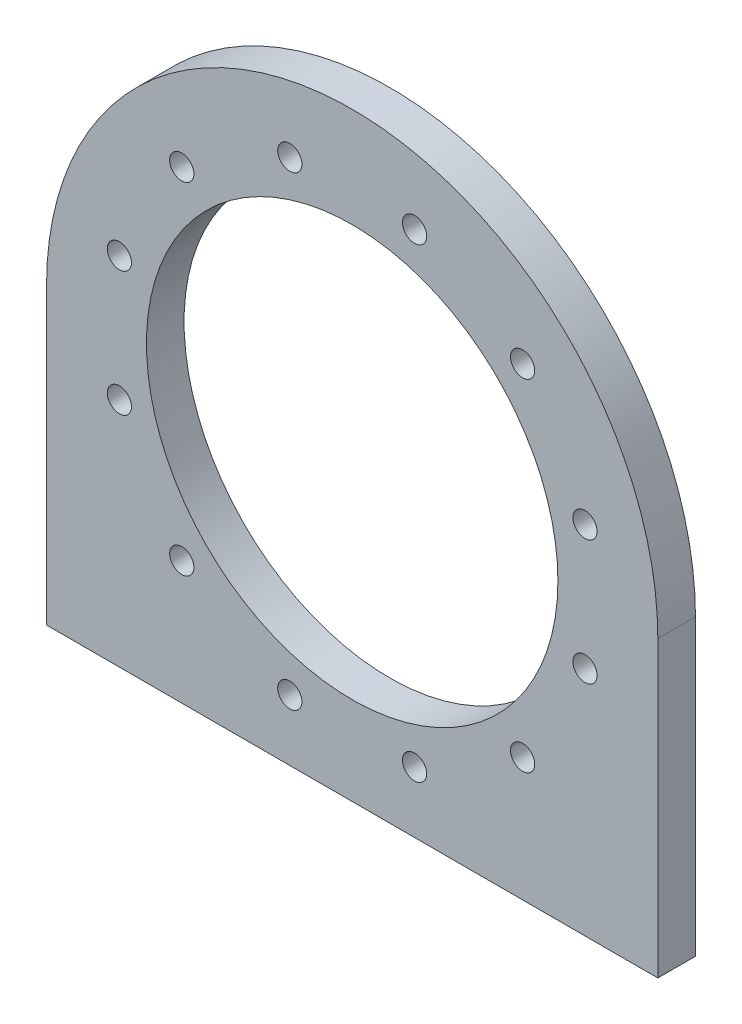
ISO-10303-21;
HEADER;
FILE_DESCRIPTION(('STEP AP214'),'2;1');
FILE_NAME('part.step','',(''),(''),'','','');
FILE_SCHEMA(('AUTOMOTIVE_DESIGN { 1 0 10303 214 1 1 1 1 }'));
ENDSEC;
DATA;
#1=APPLICATION_CONTEXT('core data for automotive mechanical design processes');
#2=APPLICATION_PROTOCOL_DEFINITION('international standard','automotive_design',2000,#1);
#3=PRODUCT_CONTEXT('',#1,'mechanical');
#4=PRODUCT('Part','Part','',(#3));
#5=PRODUCT_RELATED_PRODUCT_CATEGORY('part','',(#4));
#6=PRODUCT_DEFINITION_FORMATION('','',#4);
#7=PRODUCT_DEFINITION_CONTEXT('part definition',#1,'design');
#8=PRODUCT_DEFINITION('design','',#6,#7);
#9=PRODUCT_DEFINITION_SHAPE('','',#8);
#10=(LENGTH_UNIT() NAMED_UNIT(*) SI_UNIT(.MILLI.,.METRE.));
#11=(NAMED_UNIT(*) PLANE_ANGLE_UNIT() SI_UNIT($,.RADIAN.));
#12=(NAMED_UNIT(*) SI_UNIT($,.STERADIAN.) SOLID_ANGLE_UNIT());
#13=UNCERTAINTY_MEASURE_WITH_UNIT(LENGTH_MEASURE(1.E-05),#10,'distance_accuracy_value','');
#14=(GEOMETRIC_REPRESENTATION_CONTEXT(3) GLOBAL_UNCERTAINTY_ASSIGNED_CONTEXT((#13)) GLOBAL_UNIT_ASSIGNED_CONTEXT((#10,
#11,#12)) REPRESENTATION_CONTEXT('',''));
#15=CARTESIAN_POINT('',(0.,0.,0.));
#16=DIRECTION('',(0.,0.,1.));
#17=DIRECTION('',(1.,0.,0.));
#18=AXIS2_PLACEMENT_3D('',#15,#16,#17);
#19=CARTESIAN_POINT('',(0.,0.,16.));
#20=DIRECTION('',(0.,0.,1.));
#21=DIRECTION('',(1.,0.,0.));
#22=AXIS2_PLACEMENT_3D('',#19,#20,#21);
#23=PLANE('',#22);
#24=CARTESIAN_POINT('',(-72.4784450716212,72.478445071621,16.));
#25=DIRECTION('',(0.,0.,1.));
#26=DIRECTION('',(1.,0.,0.));
#27=AXIS2_PLACEMENT_3D('',#24,#25,#26);
#28=CIRCLE('',#27,5.15);
#29=CARTESIAN_POINT('',(-67.3284450716212,72.478445071621,16.));
#30=VERTEX_POINT('',#29);
#31=EDGE_CURVE('E160',#30,#30,#28,.T.);
#32=ORIENTED_EDGE('',*,*,#31,.F.);
#33=EDGE_LOOP('',(#32));
#34=FACE_BOUND('',#33,.T.);
#35=CARTESIAN_POINT('',(-99.0073971946295,26.5289521230082,16.));
#36=DIRECTION('',(0.,0.,1.));
#37=DIRECTION('',(1.,0.,0.));
#38=AXIS2_PLACEMENT_3D('',#35,#36,#37);
#39=CIRCLE('',#38,5.15);
#40=CARTESIAN_POINT('',(-93.8573971946295,26.5289521230082,16.));
#41=VERTEX_POINT('',#40);
#42=EDGE_CURVE('E159',#41,#41,#39,.T.);
#43=ORIENTED_EDGE('',*,*,#42,.F.);
#44=EDGE_LOOP('',(#43));
#45=FACE_BOUND('',#44,.T.);
#46=CARTESIAN_POINT('',(-99.0073971946295,-26.5289521230085,16.));
#47=DIRECTION('',(0.,0.,1.));
#48=DIRECTION('',(1.,0.,0.));
#49=AXIS2_PLACEMENT_3D('',#46,#47,#48);
#50=CIRCLE('',#49,5.15);
#51=CARTESIAN_POINT('',(-93.8573971946295,-26.5289521230085,16.));
#52=VERTEX_POINT('',#51);
#53=EDGE_CURVE('E166',#52,#52,#50,.T.);
#54=ORIENTED_EDGE('',*,*,#53,.F.);
#55=EDGE_LOOP('',(#54));
#56=FACE_BOUND('',#55,.T.);
#57=CARTESIAN_POINT('',(-72.478445071621,-72.4784450716212,16.));
#58=DIRECTION('',(0.,0.,1.));
#59=DIRECTION('',(1.,0.,0.));
#60=AXIS2_PLACEMENT_3D('',#57,#58,#59);
#61=CIRCLE('',#60,5.15);
#62=CARTESIAN_POINT('',(-67.328445071621,-72.4784450716212,16.));
#63=VERTEX_POINT('',#62);
#64=EDGE_CURVE('E172',#63,#63,#61,.T.);
#65=ORIENTED_EDGE('',*,*,#64,.F.);
#66=EDGE_LOOP('',(#65));
#67=FACE_BOUND('',#66,.T.);
#68=CARTESIAN_POINT('',(-26.5289521230083,-99.0073971946295,16.));
#69=DIRECTION('',(0.,0.,1.));
#70=DIRECTION('',(1.,0.,0.));
#71=AXIS2_PLACEMENT_3D('',#68,#69,#70);
#72=CIRCLE('',#71,5.15);
#73=CARTESIAN_POINT('',(-21.3789521230083,-99.0073971946295,16.));
#74=VERTEX_POINT('',#73);
#75=EDGE_CURVE('E178',#74,#74,#72,.T.);
#76=ORIENTED_EDGE('',*,*,#75,.F.);
#77=EDGE_LOOP('',(#76));
#78=FACE_BOUND('',#77,.T.);
#79=CARTESIAN_POINT('',(26.5289521230085,-99.0073971946295,16.));
#80=DIRECTION('',(0.,0.,1.));
#81=DIRECTION('',(1.,0.,0.));
#82=AXIS2_PLACEMENT_3D('',#79,#80,#81);
#83=CIRCLE('',#82,5.15000000000001);
#84=CARTESIAN_POINT('',(31.6789521230085,-99.0073971946295,16.));
#85=VERTEX_POINT('',#84);
#86=EDGE_CURVE('E184',#85,#85,#83,.T.);
#87=ORIENTED_EDGE('',*,*,#86,.F.);
#88=EDGE_LOOP('',(#87));
#89=FACE_BOUND('',#88,.T.);
#90=CARTESIAN_POINT('',(72.4784450716212,-72.478445071621,16.));
#91=DIRECTION('',(0.,0.,1.));
#92=DIRECTION('',(1.,0.,0.));
#93=AXIS2_PLACEMENT_3D('',#90,#91,#92);
#94=CIRCLE('',#93,5.15);
#95=CARTESIAN_POINT('',(77.6284450716212,-72.478445071621,16.));
#96=VERTEX_POINT('',#95);
#97=EDGE_CURVE('E130',#96,#96,#94,.T.);
#98=ORIENTED_EDGE('',*,*,#97,.F.);
#99=EDGE_LOOP('',(#98));
#100=FACE_BOUND('',#99,.T.);
#101=CARTESIAN_POINT('',(99.0073971946295,-26.5289521230083,16.));
#102=DIRECTION('',(0.,0.,1.));
#103=DIRECTION('',(1.,0.,0.));
#104=AXIS2_PLACEMENT_3D('',#101,#102,#103);
#105=CIRCLE('',#104,5.15);
#106=CARTESIAN_POINT('',(104.15739719463,-26.5289521230083,16.));
#107=VERTEX_POINT('',#106);
#108=EDGE_CURVE('E129',#107,#107,#105,.T.);
#109=ORIENTED_EDGE('',*,*,#108,.F.);
#110=EDGE_LOOP('',(#109));
#111=FACE_BOUND('',#110,.T.);
#112=CARTESIAN_POINT('',(99.0073971946295,26.5289521230085,16.));
#113=DIRECTION('',(0.,0.,1.));
#114=DIRECTION('',(1.,0.,0.));
#115=AXIS2_PLACEMENT_3D('',#112,#113,#114);
#116=CIRCLE('',#115,5.15000000000034);
#117=CARTESIAN_POINT('',(104.15739719463,26.5289521230085,16.));
#118=VERTEX_POINT('',#117);
#119=EDGE_CURVE('E137',#118,#118,#116,.T.);
#120=ORIENTED_EDGE('',*,*,#119,.F.);
#121=EDGE_LOOP('',(#120));
#122=FACE_BOUND('',#121,.T.);
#123=CARTESIAN_POINT('',(72.4784450716211,72.4784450716212,16.));
#124=DIRECTION('',(0.,0.,1.));
#125=DIRECTION('',(1.,0.,0.));
#126=AXIS2_PLACEMENT_3D('',#123,#124,#125);
#127=CIRCLE('',#126,5.15000000000024);
#128=CARTESIAN_POINT('',(77.6284450716213,72.4784450716212,16.));
#129=VERTEX_POINT('',#128);
#130=EDGE_CURVE('E143',#129,#129,#127,.T.);
#131=ORIENTED_EDGE('',*,*,#130,.F.);
#132=EDGE_LOOP('',(#131));
#133=FACE_BOUND('',#132,.T.);
#134=CARTESIAN_POINT('',(26.5289521230083,99.0073971946295,16.));
#135=DIRECTION('',(0.,0.,1.));
#136=DIRECTION('',(1.,0.,0.));
#137=AXIS2_PLACEMENT_3D('',#134,#135,#136);
#138=CIRCLE('',#137,5.15000000000008);
#139=CARTESIAN_POINT('',(31.6789521230084,99.0073971946295,16.));
#140=VERTEX_POINT('',#139);
#141=EDGE_CURVE('E149',#140,#140,#138,.T.);
#142=ORIENTED_EDGE('',*,*,#141,.F.);
#143=EDGE_LOOP('',(#142));
#144=FACE_BOUND('',#143,.T.);
#145=CARTESIAN_POINT('',(-26.5289521230085,99.0073971946295,16.));
#146=DIRECTION('',(0.,0.,1.));
#147=DIRECTION('',(1.,0.,0.));
#148=AXIS2_PLACEMENT_3D('',#145,#146,#147);
#149=CIRCLE('',#148,5.15);
#150=CARTESIAN_POINT('',(-21.3789521230085,99.0073971946295,16.));
#151=VERTEX_POINT('',#150);
#152=EDGE_CURVE('E122',#151,#151,#149,.T.);
#153=ORIENTED_EDGE('',*,*,#152,.F.);
#154=EDGE_LOOP('',(#153));
#155=FACE_BOUND('',#154,.T.);
#156=CARTESIAN_POINT('',(0.,0.,16.));
#157=DIRECTION('',(0.,0.,1.));
#158=DIRECTION('',(1.,0.,0.));
#159=AXIS2_PLACEMENT_3D('',#156,#157,#158);
#160=CIRCLE('',#159,130.);
#161=CARTESIAN_POINT('',(130.,0.,16.));
#162=VERTEX_POINT('',#161);
#163=CARTESIAN_POINT('',(-130.,0.,16.));
#164=VERTEX_POINT('',#163);
#165=EDGE_CURVE('E87',#162,#164,#160,.T.);
#166=ORIENTED_EDGE('',*,*,#165,.T.);
#167=DIRECTION('',(0.,-1.,0.));
#168=VECTOR('',#167,1.);
#169=CARTESIAN_POINT('',(-130.,0.,16.));
#170=LINE('',#169,#168);
#171=CARTESIAN_POINT('',(-130.,-125.,16.));
#172=VERTEX_POINT('',#171);
#173=EDGE_CURVE('E82',#164,#172,#170,.T.);
#174=ORIENTED_EDGE('',*,*,#173,.T.);
#175=DIRECTION('',(1.,0.,0.));
#176=VECTOR('',#175,1.);
#177=CARTESIAN_POINT('',(-130.,-125.,16.));
#178=LINE('',#177,#176);
#179=CARTESIAN_POINT('',(130.,-125.,16.));
#180=VERTEX_POINT('',#179);
#181=EDGE_CURVE('E85',#172,#180,#178,.T.);
#182=ORIENTED_EDGE('',*,*,#181,.T.);
#183=DIRECTION('',(0.,1.,0.));
#184=VECTOR('',#183,1.);
#185=CARTESIAN_POINT('',(130.,-125.,16.));
#186=LINE('',#185,#184);
#187=EDGE_CURVE('E52',#180,#162,#186,.T.);
#188=ORIENTED_EDGE('',*,*,#187,.T.);
#189=EDGE_LOOP('',(#166,#174,#182,#188));
#190=FACE_BOUND('',#189,.T.);
#191=CARTESIAN_POINT('',(0.,0.,16.));
#192=DIRECTION('',(0.,0.,1.));
#193=DIRECTION('',(1.,0.,0.));
#194=AXIS2_PLACEMENT_3D('',#191,#192,#193);
#195=CIRCLE('',#194,87.5);
#196=CARTESIAN_POINT('',(87.5,0.,16.));
#197=VERTEX_POINT('',#196);
#198=EDGE_CURVE('E102',#197,#197,#195,.T.);
#199=ORIENTED_EDGE('',*,*,#198,.F.);
#200=EDGE_LOOP('',(#199));
#201=FACE_BOUND('',#200,.T.);
#202=ADVANCED_FACE('F35',(#34,#45,#56,#67,#78,#89,#100,#111,#122,#133,#144,#155,#190,#201),#23,.T.);
#203=CARTESIAN_POINT('',(0.,0.,0.));
#204=DIRECTION('',(0.,0.,1.));
#205=DIRECTION('',(1.,0.,0.));
#206=AXIS2_PLACEMENT_3D('',#203,#204,#205);
#207=PLANE('',#206);
#208=CARTESIAN_POINT('',(-72.4784450716212,72.478445071621,0.));
#209=DIRECTION('',(0.,0.,1.));
#210=DIRECTION('',(1.,0.,0.));
#211=AXIS2_PLACEMENT_3D('',#208,#209,#210);
#212=CIRCLE('',#211,5.15);
#213=CARTESIAN_POINT('',(-67.3284450716212,72.478445071621,0.));
#214=VERTEX_POINT('',#213);
#215=EDGE_CURVE('E156',#214,#214,#212,.F.);
#216=ORIENTED_EDGE('',*,*,#215,.F.);
#217=EDGE_LOOP('',(#216));
#218=FACE_BOUND('',#217,.T.);
#219=CARTESIAN_POINT('',(-99.0073971946295,26.5289521230082,0.));
#220=DIRECTION('',(0.,0.,1.));
#221=DIRECTION('',(1.,0.,0.));
#222=AXIS2_PLACEMENT_3D('',#219,#220,#221);
#223=CIRCLE('',#222,5.15);
#224=CARTESIAN_POINT('',(-93.8573971946295,26.5289521230082,0.));
#225=VERTEX_POINT('',#224);
#226=EDGE_CURVE('E163',#225,#225,#223,.F.);
#227=ORIENTED_EDGE('',*,*,#226,.F.);
#228=EDGE_LOOP('',(#227));
#229=FACE_BOUND('',#228,.T.);
#230=CARTESIAN_POINT('',(-99.0073971946295,-26.5289521230085,0.));
#231=DIRECTION('',(0.,0.,1.));
#232=DIRECTION('',(1.,0.,0.));
#233=AXIS2_PLACEMENT_3D('',#230,#231,#232);
#234=CIRCLE('',#233,5.15);
#235=CARTESIAN_POINT('',(-93.8573971946295,-26.5289521230085,0.));
#236=VERTEX_POINT('',#235);
#237=EDGE_CURVE('E169',#236,#236,#234,.F.);
#238=ORIENTED_EDGE('',*,*,#237,.F.);
#239=EDGE_LOOP('',(#238));
#240=FACE_BOUND('',#239,.T.);
#241=CARTESIAN_POINT('',(-72.478445071621,-72.4784450716212,0.));
#242=DIRECTION('',(0.,0.,1.));
#243=DIRECTION('',(1.,0.,0.));
#244=AXIS2_PLACEMENT_3D('',#241,#242,#243);
#245=CIRCLE('',#244,5.15);
#246=CARTESIAN_POINT('',(-67.328445071621,-72.4784450716212,0.));
#247=VERTEX_POINT('',#246);
#248=EDGE_CURVE('E175',#247,#247,#245,.F.);
#249=ORIENTED_EDGE('',*,*,#248,.F.);
#250=EDGE_LOOP('',(#249));
#251=FACE_BOUND('',#250,.T.);
#252=CARTESIAN_POINT('',(-26.5289521230083,-99.0073971946295,0.));
#253=DIRECTION('',(0.,0.,1.));
#254=DIRECTION('',(1.,0.,0.));
#255=AXIS2_PLACEMENT_3D('',#252,#253,#254);
#256=CIRCLE('',#255,5.15);
#257=CARTESIAN_POINT('',(-21.3789521230083,-99.0073971946295,0.));
#258=VERTEX_POINT('',#257);
#259=EDGE_CURVE('E181',#258,#258,#256,.F.);
#260=ORIENTED_EDGE('',*,*,#259,.F.);
#261=EDGE_LOOP('',(#260));
#262=FACE_BOUND('',#261,.T.);
#263=CARTESIAN_POINT('',(26.5289521230085,-99.0073971946295,0.));
#264=DIRECTION('',(0.,0.,1.));
#265=DIRECTION('',(1.,0.,0.));
#266=AXIS2_PLACEMENT_3D('',#263,#264,#265);
#267=CIRCLE('',#266,5.15000000000001);
#268=CARTESIAN_POINT('',(31.6789521230085,-99.0073971946295,0.));
#269=VERTEX_POINT('',#268);
#270=EDGE_CURVE('E133',#269,#269,#267,.F.);
#271=ORIENTED_EDGE('',*,*,#270,.F.);
#272=EDGE_LOOP('',(#271));
#273=FACE_BOUND('',#272,.T.);
#274=CARTESIAN_POINT('',(72.4784450716212,-72.478445071621,0.));
#275=DIRECTION('',(0.,0.,1.));
#276=DIRECTION('',(1.,0.,0.));
#277=AXIS2_PLACEMENT_3D('',#274,#275,#276);
#278=CIRCLE('',#277,5.15);
#279=CARTESIAN_POINT('',(77.6284450716212,-72.478445071621,0.));
#280=VERTEX_POINT('',#279);
#281=EDGE_CURVE('E126',#280,#280,#278,.F.);
#282=ORIENTED_EDGE('',*,*,#281,.F.);
#283=EDGE_LOOP('',(#282));
#284=FACE_BOUND('',#283,.T.);
#285=CARTESIAN_POINT('',(99.0073971946295,-26.5289521230083,0.));
#286=DIRECTION('',(0.,0.,1.));
#287=DIRECTION('',(1.,0.,0.));
#288=AXIS2_PLACEMENT_3D('',#285,#286,#287);
#289=CIRCLE('',#288,5.15);
#290=CARTESIAN_POINT('',(104.15739719463,-26.5289521230083,0.));
#291=VERTEX_POINT('',#290);
#292=EDGE_CURVE('E134',#291,#291,#289,.F.);
#293=ORIENTED_EDGE('',*,*,#292,.F.);
#294=EDGE_LOOP('',(#293));
#295=FACE_BOUND('',#294,.T.);
#296=CARTESIAN_POINT('',(99.0073971946295,26.5289521230085,0.));
#297=DIRECTION('',(0.,0.,1.));
#298=DIRECTION('',(1.,0.,0.));
#299=AXIS2_PLACEMENT_3D('',#296,#297,#298);
#300=CIRCLE('',#299,5.15000000000034);
#301=CARTESIAN_POINT('',(104.15739719463,26.5289521230085,0.));
#302=VERTEX_POINT('',#301);
#303=EDGE_CURVE('E140',#302,#302,#300,.F.);
#304=ORIENTED_EDGE('',*,*,#303,.F.);
#305=EDGE_LOOP('',(#304));
#306=FACE_BOUND('',#305,.T.);
#307=CARTESIAN_POINT('',(72.4784450716211,72.4784450716212,0.));
#308=DIRECTION('',(0.,0.,1.));
#309=DIRECTION('',(1.,0.,0.));
#310=AXIS2_PLACEMENT_3D('',#307,#308,#309);
#311=CIRCLE('',#310,5.15000000000024);
#312=CARTESIAN_POINT('',(77.6284450716213,72.4784450716212,0.));
#313=VERTEX_POINT('',#312);
#314=EDGE_CURVE('E146',#313,#313,#311,.F.);
#315=ORIENTED_EDGE('',*,*,#314,.F.);
#316=EDGE_LOOP('',(#315));
#317=FACE_BOUND('',#316,.T.);
#318=CARTESIAN_POINT('',(26.5289521230083,99.0073971946295,0.));
#319=DIRECTION('',(0.,0.,1.));
#320=DIRECTION('',(1.,0.,0.));
#321=AXIS2_PLACEMENT_3D('',#318,#319,#320);
#322=CIRCLE('',#321,5.15000000000008);
#323=CARTESIAN_POINT('',(31.6789521230084,99.0073971946295,0.));
#324=VERTEX_POINT('',#323);
#325=EDGE_CURVE('E125',#324,#324,#322,.F.);
#326=ORIENTED_EDGE('',*,*,#325,.F.);
#327=EDGE_LOOP('',(#326));
#328=FACE_BOUND('',#327,.T.);
#329=CARTESIAN_POINT('',(-26.5289521230085,99.0073971946295,0.));
#330=DIRECTION('',(0.,0.,1.));
#331=DIRECTION('',(1.,0.,0.));
#332=AXIS2_PLACEMENT_3D('',#329,#330,#331);
#333=CIRCLE('',#332,5.15);
#334=CARTESIAN_POINT('',(-21.3789521230085,99.0073971946295,0.));
#335=VERTEX_POINT('',#334);
#336=EDGE_CURVE('E117',#335,#335,#333,.F.);
#337=ORIENTED_EDGE('',*,*,#336,.F.);
#338=EDGE_LOOP('',(#337));
#339=FACE_BOUND('',#338,.T.);
#340=CARTESIAN_POINT('',(0.,0.,0.));
#341=DIRECTION('',(0.,0.,1.));
#342=DIRECTION('',(1.,0.,0.));
#343=AXIS2_PLACEMENT_3D('',#340,#341,#342);
#344=CIRCLE('',#343,130.);
#345=CARTESIAN_POINT('',(130.,0.,0.));
#346=VERTEX_POINT('',#345);
#347=CARTESIAN_POINT('',(-130.,0.,0.));
#348=VERTEX_POINT('',#347);
#349=EDGE_CURVE('E99',#346,#348,#344,.T.);
#350=ORIENTED_EDGE('',*,*,#349,.F.);
#351=DIRECTION('',(0.,1.,0.));
#352=VECTOR('',#351,1.);
#353=CARTESIAN_POINT('',(130.,-125.,0.));
#354=LINE('',#353,#352);
#355=CARTESIAN_POINT('',(130.,-125.,0.));
#356=VERTEX_POINT('',#355);
#357=EDGE_CURVE('E75',#356,#346,#354,.T.);
#358=ORIENTED_EDGE('',*,*,#357,.F.);
#359=DIRECTION('',(1.,0.,0.));
#360=VECTOR('',#359,1.);
#361=CARTESIAN_POINT('',(-130.,-125.,0.));
#362=LINE('',#361,#360);
#363=CARTESIAN_POINT('',(-130.,-125.,0.));
#364=VERTEX_POINT('',#363);
#365=EDGE_CURVE('E69',#364,#356,#362,.T.);
#366=ORIENTED_EDGE('',*,*,#365,.F.);
#367=DIRECTION('',(0.,-1.,0.));
#368=VECTOR('',#367,1.);
#369=CARTESIAN_POINT('',(-130.,0.,0.));
#370=LINE('',#369,#368);
#371=EDGE_CURVE('E91',#348,#364,#370,.T.);
#372=ORIENTED_EDGE('',*,*,#371,.F.);
#373=EDGE_LOOP('',(#350,#358,#366,#372));
#374=FACE_BOUND('',#373,.T.);
#375=CARTESIAN_POINT('',(0.,0.,0.));
#376=DIRECTION('',(0.,0.,1.));
#377=DIRECTION('',(1.,0.,0.));
#378=AXIS2_PLACEMENT_3D('',#375,#376,#377);
#379=CIRCLE('',#378,87.5);
#380=CARTESIAN_POINT('',(87.5,0.,0.));
#381=VERTEX_POINT('',#380);
#382=EDGE_CURVE('E114',#381,#381,#379,.T.);
#383=ORIENTED_EDGE('',*,*,#382,.T.);
#384=EDGE_LOOP('',(#383));
#385=FACE_BOUND('',#384,.T.);
#386=ADVANCED_FACE('F110',(#218,#229,#240,#251,#262,#273,#284,#295,#306,#317,#328,#339,#374,
#385),#207,.F.);
#387=CARTESIAN_POINT('',(0.,0.,16.));
#388=DIRECTION('',(0.,0.,-1.));
#389=DIRECTION('',(-1.,0.,0.));
#390=AXIS2_PLACEMENT_3D('',#387,#388,#389);
#391=CYLINDRICAL_SURFACE('',#390,130.);
#392=ORIENTED_EDGE('',*,*,#349,.T.);
#393=DIRECTION('',(0.,0.,-1.));
#394=VECTOR('',#393,1.);
#395=CARTESIAN_POINT('',(-130.,0.,16.));
#396=LINE('',#395,#394);
#397=EDGE_CURVE('E11',#164,#348,#396,.T.);
#398=ORIENTED_EDGE('',*,*,#397,.F.);
#399=ORIENTED_EDGE('',*,*,#165,.F.);
#400=DIRECTION('',(0.,0.,-1.));
#401=VECTOR('',#400,1.);
#402=CARTESIAN_POINT('',(130.,0.,16.));
#403=LINE('',#402,#401);
#404=EDGE_CURVE('E95',#162,#346,#403,.T.);
#405=ORIENTED_EDGE('',*,*,#404,.T.);
#406=EDGE_LOOP('',(#392,#398,#399,#405));
#407=FACE_BOUND('',#406,.T.);
#408=ADVANCED_FACE('F37',(#407),#391,.T.);
#409=CARTESIAN_POINT('',(-130.,0.,16.));
#410=DIRECTION('',(1.,0.,0.));
#411=DIRECTION('',(0.,1.,0.));
#412=AXIS2_PLACEMENT_3D('',#409,#410,#411);
#413=PLANE('',#412);
#414=ORIENTED_EDGE('',*,*,#371,.T.);
#415=DIRECTION('',(0.,0.,-1.));
#416=VECTOR('',#415,1.);
#417=CARTESIAN_POINT('',(-130.,-125.,16.));
#418=LINE('',#417,#416);
#419=EDGE_CURVE('E44',#172,#364,#418,.T.);
#420=ORIENTED_EDGE('',*,*,#419,.F.);
#421=ORIENTED_EDGE('',*,*,#173,.F.);
#422=ORIENTED_EDGE('',*,*,#397,.T.);
#423=EDGE_LOOP('',(#414,#420,#421,#422));
#424=FACE_BOUND('',#423,.T.);
#425=ADVANCED_FACE('F90',(#424),#413,.F.);
#426=CARTESIAN_POINT('',(-130.,-125.,16.));
#427=DIRECTION('',(0.,1.,0.));
#428=DIRECTION('',(0.,0.,1.));
#429=AXIS2_PLACEMENT_3D('',#426,#427,#428);
#430=PLANE('',#429);
#431=ORIENTED_EDGE('',*,*,#365,.T.);
#432=DIRECTION('',(0.,0.,-1.));
#433=VECTOR('',#432,1.);
#434=CARTESIAN_POINT('',(130.,-125.,16.));
#435=LINE('',#434,#433);
#436=EDGE_CURVE('E92',#180,#356,#435,.T.);
#437=ORIENTED_EDGE('',*,*,#436,.F.);
#438=ORIENTED_EDGE('',*,*,#181,.F.);
#439=ORIENTED_EDGE('',*,*,#419,.T.);
#440=EDGE_LOOP('',(#431,#437,#438,#439));
#441=FACE_BOUND('',#440,.T.);
#442=ADVANCED_FACE('F93',(#441),#430,.F.);
#443=CARTESIAN_POINT('',(130.,-125.,16.));
#444=DIRECTION('',(-1.,0.,0.));
#445=DIRECTION('',(0.,-1.,0.));
#446=AXIS2_PLACEMENT_3D('',#443,#444,#445);
#447=PLANE('',#446);
#448=ORIENTED_EDGE('',*,*,#357,.T.);
#449=ORIENTED_EDGE('',*,*,#404,.F.);
#450=ORIENTED_EDGE('',*,*,#187,.F.);
#451=ORIENTED_EDGE('',*,*,#436,.T.);
#452=EDGE_LOOP('',(#448,#449,#450,#451));
#453=FACE_BOUND('',#452,.T.);
#454=ADVANCED_FACE('F107',(#453),#447,.F.);
#455=CARTESIAN_POINT('',(0.,0.,16.));
#456=DIRECTION('',(0.,0.,-1.));
#457=DIRECTION('',(-1.,0.,0.));
#458=AXIS2_PLACEMENT_3D('',#455,#456,#457);
#459=CYLINDRICAL_SURFACE('',#458,87.5);
#460=ORIENTED_EDGE('',*,*,#198,.T.);
#461=EDGE_LOOP('',(#460));
#462=FACE_BOUND('',#461,.T.);
#463=ORIENTED_EDGE('',*,*,#382,.F.);
#464=EDGE_LOOP('',(#463));
#465=FACE_BOUND('',#464,.T.);
#466=ADVANCED_FACE('F215',(#462,#465),#459,.F.);
#467=CARTESIAN_POINT('',(-26.5289521230085,99.0073971946295,-0.001000000000001));
#468=DIRECTION('',(0.,0.,1.));
#469=DIRECTION('',(1.,0.,0.));
#470=AXIS2_PLACEMENT_3D('',#467,#468,#469);
#471=CYLINDRICAL_SURFACE('',#470,5.15);
#472=ORIENTED_EDGE('',*,*,#152,.T.);
#473=EDGE_LOOP('',(#472));
#474=FACE_BOUND('',#473,.T.);
#475=ORIENTED_EDGE('',*,*,#336,.T.);
#476=EDGE_LOOP('',(#475));
#477=FACE_BOUND('',#476,.T.);
#478=ADVANCED_FACE('F211',(#474,#477),#471,.F.);
#479=CARTESIAN_POINT('',(26.5289521230083,99.0073971946295,-0.001000000000001));
#480=DIRECTION('',(0.,0.,1.));
#481=DIRECTION('',(1.,0.,0.));
#482=AXIS2_PLACEMENT_3D('',#479,#480,#481);
#483=CYLINDRICAL_SURFACE('',#482,5.15000000000008);
#484=ORIENTED_EDGE('',*,*,#141,.T.);
#485=EDGE_LOOP('',(#484));
#486=FACE_BOUND('',#485,.T.);
#487=ORIENTED_EDGE('',*,*,#325,.T.);
#488=EDGE_LOOP('',(#487));
#489=FACE_BOUND('',#488,.T.);
#490=ADVANCED_FACE('F214',(#486,#489),#483,.F.);
#491=CARTESIAN_POINT('',(72.4784450716211,72.4784450716212,-0.001000000000001));
#492=DIRECTION('',(0.,0.,1.));
#493=DIRECTION('',(1.,0.,0.));
#494=AXIS2_PLACEMENT_3D('',#491,#492,#493);
#495=CYLINDRICAL_SURFACE('',#494,5.15000000000024);
#496=ORIENTED_EDGE('',*,*,#130,.T.);
#497=EDGE_LOOP('',(#496));
#498=FACE_BOUND('',#497,.T.);
#499=ORIENTED_EDGE('',*,*,#314,.T.);
#500=EDGE_LOOP('',(#499));
#501=FACE_BOUND('',#500,.T.);
#502=ADVANCED_FACE('F262',(#498,#501),#495,.F.);
#503=CARTESIAN_POINT('',(99.0073971946295,26.5289521230085,-0.001000000000001));
#504=DIRECTION('',(0.,0.,1.));
#505=DIRECTION('',(1.,0.,0.));
#506=AXIS2_PLACEMENT_3D('',#503,#504,#505);
#507=CYLINDRICAL_SURFACE('',#506,5.15000000000034);
#508=ORIENTED_EDGE('',*,*,#119,.T.);
#509=EDGE_LOOP('',(#508));
#510=FACE_BOUND('',#509,.T.);
#511=ORIENTED_EDGE('',*,*,#303,.T.);
#512=EDGE_LOOP('',(#511));
#513=FACE_BOUND('',#512,.T.);
#514=ADVANCED_FACE('F270',(#510,#513),#507,.F.);
#515=CARTESIAN_POINT('',(99.0073971946295,-26.5289521230083,-0.001000000000001));
#516=DIRECTION('',(0.,0.,1.));
#517=DIRECTION('',(1.,0.,0.));
#518=AXIS2_PLACEMENT_3D('',#515,#516,#517);
#519=CYLINDRICAL_SURFACE('',#518,5.15);
#520=ORIENTED_EDGE('',*,*,#108,.T.);
#521=EDGE_LOOP('',(#520));
#522=FACE_BOUND('',#521,.T.);
#523=ORIENTED_EDGE('',*,*,#292,.T.);
#524=EDGE_LOOP('',(#523));
#525=FACE_BOUND('',#524,.T.);
#526=ADVANCED_FACE('F278',(#522,#525),#519,.F.);
#527=CARTESIAN_POINT('',(72.4784450716212,-72.478445071621,-0.001000000000001));
#528=DIRECTION('',(0.,0.,1.));
#529=DIRECTION('',(1.,0.,0.));
#530=AXIS2_PLACEMENT_3D('',#527,#528,#529);
#531=CYLINDRICAL_SURFACE('',#530,5.15);
#532=ORIENTED_EDGE('',*,*,#97,.T.);
#533=EDGE_LOOP('',(#532));
#534=FACE_BOUND('',#533,.T.);
#535=ORIENTED_EDGE('',*,*,#281,.T.);
#536=EDGE_LOOP('',(#535));
#537=FACE_BOUND('',#536,.T.);
#538=ADVANCED_FACE('F286',(#534,#537),#531,.F.);
#539=CARTESIAN_POINT('',(26.5289521230085,-99.0073971946295,-0.001000000000001));
#540=DIRECTION('',(0.,0.,1.));
#541=DIRECTION('',(1.,0.,0.));
#542=AXIS2_PLACEMENT_3D('',#539,#540,#541);
#543=CYLINDRICAL_SURFACE('',#542,5.15000000000001);
#544=ORIENTED_EDGE('',*,*,#86,.T.);
#545=EDGE_LOOP('',(#544));
#546=FACE_BOUND('',#545,.T.);
#547=ORIENTED_EDGE('',*,*,#270,.T.);
#548=EDGE_LOOP('',(#547));
#549=FACE_BOUND('',#548,.T.);
#550=ADVANCED_FACE('F192',(#546,#549),#543,.F.);
#551=CARTESIAN_POINT('',(-26.5289521230083,-99.0073971946295,-0.001000000000001));
#552=DIRECTION('',(0.,0.,1.));
#553=DIRECTION('',(1.,0.,0.));
#554=AXIS2_PLACEMENT_3D('',#551,#552,#553);
#555=CYLINDRICAL_SURFACE('',#554,5.15);
#556=ORIENTED_EDGE('',*,*,#75,.T.);
#557=EDGE_LOOP('',(#556));
#558=FACE_BOUND('',#557,.T.);
#559=ORIENTED_EDGE('',*,*,#259,.T.);
#560=EDGE_LOOP('',(#559));
#561=FACE_BOUND('',#560,.T.);
#562=ADVANCED_FACE('F301',(#558,#561),#555,.F.);
#563=CARTESIAN_POINT('',(-72.478445071621,-72.4784450716212,-0.001000000000001));
#564=DIRECTION('',(0.,0.,1.));
#565=DIRECTION('',(1.,0.,0.));
#566=AXIS2_PLACEMENT_3D('',#563,#564,#565);
#567=CYLINDRICAL_SURFACE('',#566,5.15);
#568=ORIENTED_EDGE('',*,*,#64,.T.);
#569=EDGE_LOOP('',(#568));
#570=FACE_BOUND('',#569,.T.);
#571=ORIENTED_EDGE('',*,*,#248,.T.);
#572=EDGE_LOOP('',(#571));
#573=FACE_BOUND('',#572,.T.);
#574=ADVANCED_FACE('F308',(#570,#573),#567,.F.);
#575=CARTESIAN_POINT('',(-99.0073971946295,-26.5289521230085,-0.001000000000001));
#576=DIRECTION('',(0.,0.,1.));
#577=DIRECTION('',(1.,0.,0.));
#578=AXIS2_PLACEMENT_3D('',#575,#576,#577);
#579=CYLINDRICAL_SURFACE('',#578,5.15);
#580=ORIENTED_EDGE('',*,*,#53,.T.);
#581=EDGE_LOOP('',(#580));
#582=FACE_BOUND('',#581,.T.);
#583=ORIENTED_EDGE('',*,*,#237,.T.);
#584=EDGE_LOOP('',(#583));
#585=FACE_BOUND('',#584,.T.);
#586=ADVANCED_FACE('F316',(#582,#585),#579,.F.);
#587=CARTESIAN_POINT('',(-99.0073971946295,26.5289521230082,-0.001000000000001));
#588=DIRECTION('',(0.,0.,1.));
#589=DIRECTION('',(1.,0.,0.));
#590=AXIS2_PLACEMENT_3D('',#587,#588,#589);
#591=CYLINDRICAL_SURFACE('',#590,5.15);
#592=ORIENTED_EDGE('',*,*,#42,.T.);
#593=EDGE_LOOP('',(#592));
#594=FACE_BOUND('',#593,.T.);
#595=ORIENTED_EDGE('',*,*,#226,.T.);
#596=EDGE_LOOP('',(#595));
#597=FACE_BOUND('',#596,.T.);
#598=ADVANCED_FACE('F324',(#594,#597),#591,.F.);
#599=CARTESIAN_POINT('',(-72.4784450716212,72.478445071621,-0.001000000000001));
#600=DIRECTION('',(0.,0.,1.));
#601=DIRECTION('',(1.,0.,0.));
#602=AXIS2_PLACEMENT_3D('',#599,#600,#601);
#603=CYLINDRICAL_SURFACE('',#602,5.15);
#604=ORIENTED_EDGE('',*,*,#31,.T.);
#605=EDGE_LOOP('',(#604));
#606=FACE_BOUND('',#605,.T.);
#607=ORIENTED_EDGE('',*,*,#215,.T.);
#608=EDGE_LOOP('',(#607));
#609=FACE_BOUND('',#608,.T.);
#610=ADVANCED_FACE('F332',(#606,#609),#603,.F.);
#611=CLOSED_SHELL('',(#202,#386,#408,#425,#442,#454,#466,#478,#490,#502,#514,#526,#538,#550,
#562,#574,#586,#598,#610));
#612=MANIFOLD_SOLID_BREP('B2',#611);
#613=ADVANCED_BREP_SHAPE_REPRESENTATION('',(#18,#612),#14);
#614=SHAPE_DEFINITION_REPRESENTATION(#9,#613);
ENDSEC;
END-ISO-10303-21;
